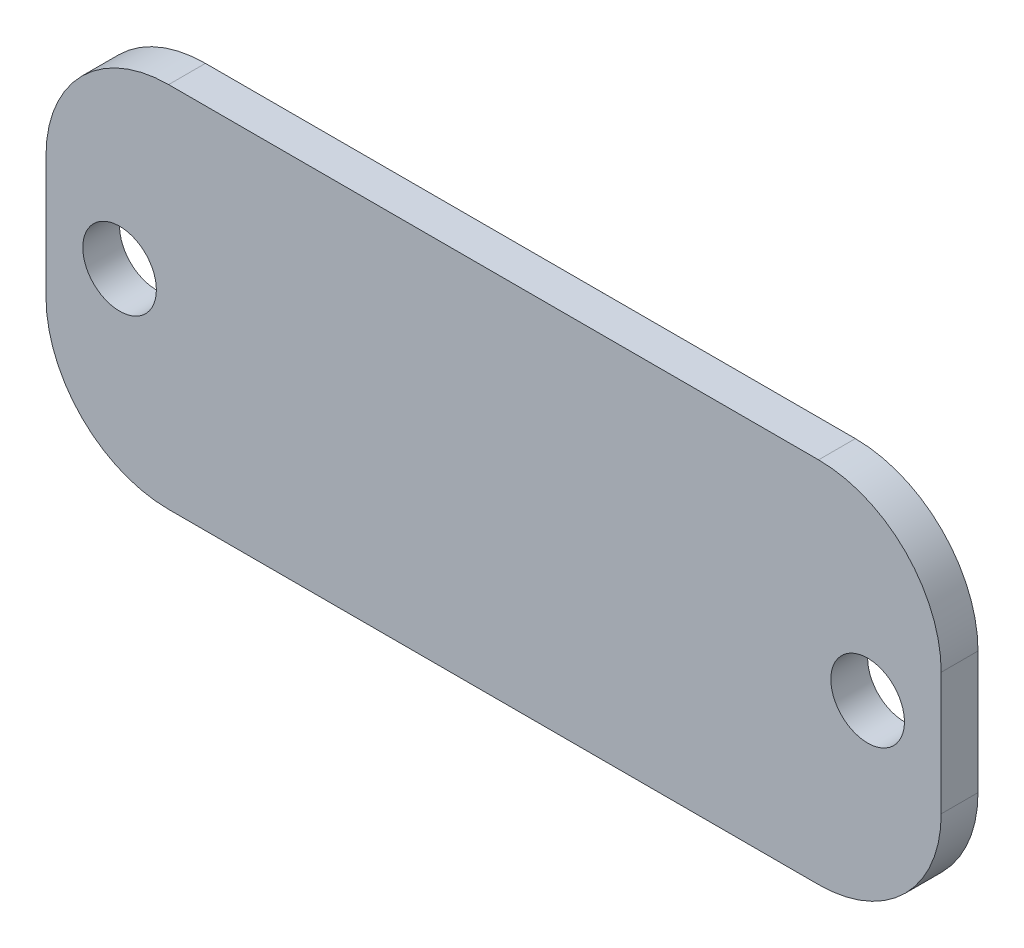
ISO-10303-21;
HEADER;
FILE_DESCRIPTION(('STEP AP214'),'2;1');
FILE_NAME('part.step','',(''),(''),'','','');
FILE_SCHEMA(('AUTOMOTIVE_DESIGN { 1 0 10303 214 1 1 1 1 }'));
ENDSEC;
DATA;
#1=APPLICATION_CONTEXT('core data for automotive mechanical design processes');
#2=APPLICATION_PROTOCOL_DEFINITION('international standard','automotive_design',2000,#1);
#3=PRODUCT_CONTEXT('',#1,'mechanical');
#4=PRODUCT('Part','Part','',(#3));
#5=PRODUCT_RELATED_PRODUCT_CATEGORY('part','',(#4));
#6=PRODUCT_DEFINITION_FORMATION('','',#4);
#7=PRODUCT_DEFINITION_CONTEXT('part definition',#1,'design');
#8=PRODUCT_DEFINITION('design','',#6,#7);
#9=PRODUCT_DEFINITION_SHAPE('','',#8);
#10=(LENGTH_UNIT() NAMED_UNIT(*) SI_UNIT(.MILLI.,.METRE.));
#11=(NAMED_UNIT(*) PLANE_ANGLE_UNIT() SI_UNIT($,.RADIAN.));
#12=(NAMED_UNIT(*) SI_UNIT($,.STERADIAN.) SOLID_ANGLE_UNIT());
#13=UNCERTAINTY_MEASURE_WITH_UNIT(LENGTH_MEASURE(1.E-05),#10,'distance_accuracy_value','');
#14=(GEOMETRIC_REPRESENTATION_CONTEXT(3) GLOBAL_UNCERTAINTY_ASSIGNED_CONTEXT((#13)) GLOBAL_UNIT_ASSIGNED_CONTEXT((#10,
#11,#12)) REPRESENTATION_CONTEXT('',''));
#15=CARTESIAN_POINT('',(0.,0.,0.));
#16=DIRECTION('',(0.,0.,1.));
#17=DIRECTION('',(1.,0.,0.));
#18=AXIS2_PLACEMENT_3D('',#15,#16,#17);
#19=CARTESIAN_POINT('',(63.,20.,3.));
#20=DIRECTION('',(0.,0.,-1.));
#21=DIRECTION('',(-1.,0.,0.));
#22=AXIS2_PLACEMENT_3D('',#19,#20,#21);
#23=PLANE('',#22);
#24=CARTESIAN_POINT('',(63.,20.,3.));
#25=DIRECTION('',(0.,0.,1.));
#26=DIRECTION('',(-1.,0.,0.));
#27=AXIS2_PLACEMENT_3D('',#24,#25,#26);
#28=CIRCLE('',#27,10.);
#29=CARTESIAN_POINT('',(73.,20.,3.));
#30=VERTEX_POINT('',#29);
#31=CARTESIAN_POINT('',(63.,30.,3.));
#32=VERTEX_POINT('',#31);
#33=EDGE_CURVE('E167',#30,#32,#28,.T.);
#34=ORIENTED_EDGE('',*,*,#33,.T.);
#35=DIRECTION('',(-1.,0.,0.));
#36=VECTOR('',#35,1.);
#37=CARTESIAN_POINT('',(10.0000000000001,30.,3.));
#38=LINE('',#37,#36);
#39=CARTESIAN_POINT('',(10.0000000000001,30.,3.));
#40=VERTEX_POINT('',#39);
#41=EDGE_CURVE('E103',#32,#40,#38,.T.);
#42=ORIENTED_EDGE('',*,*,#41,.T.);
#43=CARTESIAN_POINT('',(10.,20.,3.));
#44=DIRECTION('',(0.,0.,1.));
#45=DIRECTION('',(-1.,0.,0.));
#46=AXIS2_PLACEMENT_3D('',#43,#44,#45);
#47=CIRCLE('',#46,10.);
#48=CARTESIAN_POINT('',(0.,19.9999999999999,3.));
#49=VERTEX_POINT('',#48);
#50=EDGE_CURVE('E188',#40,#49,#47,.T.);
#51=ORIENTED_EDGE('',*,*,#50,.T.);
#52=DIRECTION('',(0.,-1.,0.));
#53=VECTOR('',#52,1.);
#54=CARTESIAN_POINT('',(0.,10.0000000000001,3.));
#55=LINE('',#54,#53);
#56=CARTESIAN_POINT('',(0.,10.0000000000001,3.));
#57=VERTEX_POINT('',#56);
#58=EDGE_CURVE('E202',#49,#57,#55,.T.);
#59=ORIENTED_EDGE('',*,*,#58,.T.);
#60=CARTESIAN_POINT('',(10.,10.,3.));
#61=DIRECTION('',(0.,0.,1.));
#62=DIRECTION('',(-1.,0.,0.));
#63=AXIS2_PLACEMENT_3D('',#60,#61,#62);
#64=CIRCLE('',#63,10.);
#65=CARTESIAN_POINT('',(10.0000000000001,0.,3.));
#66=VERTEX_POINT('',#65);
#67=EDGE_CURVE('E122',#57,#66,#64,.T.);
#68=ORIENTED_EDGE('',*,*,#67,.T.);
#69=DIRECTION('',(1.,0.,0.));
#70=VECTOR('',#69,1.);
#71=CARTESIAN_POINT('',(10.0000000000001,0.,3.));
#72=LINE('',#71,#70);
#73=CARTESIAN_POINT('',(63.,0.,3.));
#74=VERTEX_POINT('',#73);
#75=EDGE_CURVE('E116',#66,#74,#72,.T.);
#76=ORIENTED_EDGE('',*,*,#75,.T.);
#77=CARTESIAN_POINT('',(63.,10.,3.));
#78=DIRECTION('',(0.,0.,1.));
#79=DIRECTION('',(-1.,0.,0.));
#80=AXIS2_PLACEMENT_3D('',#77,#78,#79);
#81=CIRCLE('',#80,10.);
#82=CARTESIAN_POINT('',(73.,10.,3.));
#83=VERTEX_POINT('',#82);
#84=EDGE_CURVE('E120',#74,#83,#81,.T.);
#85=ORIENTED_EDGE('',*,*,#84,.T.);
#86=DIRECTION('',(0.,1.,0.));
#87=VECTOR('',#86,1.);
#88=CARTESIAN_POINT('',(73.,10.,3.));
#89=LINE('',#88,#87);
#90=EDGE_CURVE('E60',#83,#30,#89,.T.);
#91=ORIENTED_EDGE('',*,*,#90,.T.);
#92=EDGE_LOOP('',(#34,#42,#51,#59,#68,#76,#85,#91));
#93=FACE_BOUND('',#92,.T.);
#94=CARTESIAN_POINT('',(6.,15.,3.));
#95=DIRECTION('',(0.,0.,1.));
#96=DIRECTION('',(1.,0.,0.));
#97=AXIS2_PLACEMENT_3D('',#94,#95,#96);
#98=CIRCLE('',#97,3.);
#99=CARTESIAN_POINT('',(9.,15.,3.));
#100=VERTEX_POINT('',#99);
#101=EDGE_CURVE('E149',#100,#100,#98,.T.);
#102=ORIENTED_EDGE('',*,*,#101,.F.);
#103=EDGE_LOOP('',(#102));
#104=FACE_BOUND('',#103,.T.);
#105=CARTESIAN_POINT('',(67.,15.,3.));
#106=DIRECTION('',(0.,0.,1.));
#107=DIRECTION('',(-1.,0.,0.));
#108=AXIS2_PLACEMENT_3D('',#105,#106,#107);
#109=CIRCLE('',#108,3.00000000000001);
#110=CARTESIAN_POINT('',(64.,15.,3.));
#111=VERTEX_POINT('',#110);
#112=EDGE_CURVE('E216',#111,#111,#109,.T.);
#113=ORIENTED_EDGE('',*,*,#112,.F.);
#114=EDGE_LOOP('',(#113));
#115=FACE_BOUND('',#114,.T.);
#116=ADVANCED_FACE('F42',(#93,#104,#115),#23,.F.);
#117=CARTESIAN_POINT('',(63.,20.,0.));
#118=DIRECTION('',(0.,0.,-1.));
#119=DIRECTION('',(-1.,0.,0.));
#120=AXIS2_PLACEMENT_3D('',#117,#118,#119);
#121=PLANE('',#120);
#122=CARTESIAN_POINT('',(6.,15.,0.));
#123=DIRECTION('',(0.,0.,1.));
#124=DIRECTION('',(1.,0.,0.));
#125=AXIS2_PLACEMENT_3D('',#122,#123,#124);
#126=CIRCLE('',#125,3.);
#127=CARTESIAN_POINT('',(9.,15.,0.));
#128=VERTEX_POINT('',#127);
#129=EDGE_CURVE('E212',#128,#128,#126,.T.);
#130=ORIENTED_EDGE('',*,*,#129,.T.);
#131=EDGE_LOOP('',(#130));
#132=FACE_BOUND('',#131,.T.);
#133=CARTESIAN_POINT('',(63.,20.,0.));
#134=DIRECTION('',(0.,0.,1.));
#135=DIRECTION('',(-1.,0.,0.));
#136=AXIS2_PLACEMENT_3D('',#133,#134,#135);
#137=CIRCLE('',#136,10.);
#138=CARTESIAN_POINT('',(73.,20.,0.));
#139=VERTEX_POINT('',#138);
#140=CARTESIAN_POINT('',(63.,30.,0.));
#141=VERTEX_POINT('',#140);
#142=EDGE_CURVE('E144',#139,#141,#137,.T.);
#143=ORIENTED_EDGE('',*,*,#142,.F.);
#144=DIRECTION('',(0.,1.,0.));
#145=VECTOR('',#144,1.);
#146=CARTESIAN_POINT('',(73.,10.,0.));
#147=LINE('',#146,#145);
#148=CARTESIAN_POINT('',(73.,10.,0.));
#149=VERTEX_POINT('',#148);
#150=EDGE_CURVE('E95',#149,#139,#147,.T.);
#151=ORIENTED_EDGE('',*,*,#150,.F.);
#152=CARTESIAN_POINT('',(63.,10.,0.));
#153=DIRECTION('',(0.,0.,1.));
#154=DIRECTION('',(-1.,0.,0.));
#155=AXIS2_PLACEMENT_3D('',#152,#153,#154);
#156=CIRCLE('',#155,10.);
#157=CARTESIAN_POINT('',(63.,0.,0.));
#158=VERTEX_POINT('',#157);
#159=EDGE_CURVE('E89',#158,#149,#156,.T.);
#160=ORIENTED_EDGE('',*,*,#159,.F.);
#161=DIRECTION('',(1.,0.,0.));
#162=VECTOR('',#161,1.);
#163=CARTESIAN_POINT('',(10.0000000000001,0.,0.));
#164=LINE('',#163,#162);
#165=CARTESIAN_POINT('',(10.0000000000001,0.,0.));
#166=VERTEX_POINT('',#165);
#167=EDGE_CURVE('E131',#166,#158,#164,.T.);
#168=ORIENTED_EDGE('',*,*,#167,.F.);
#169=CARTESIAN_POINT('',(10.,10.,0.));
#170=DIRECTION('',(0.,0.,1.));
#171=DIRECTION('',(-1.,0.,0.));
#172=AXIS2_PLACEMENT_3D('',#169,#170,#171);
#173=CIRCLE('',#172,10.);
#174=CARTESIAN_POINT('',(0.,10.0000000000001,0.));
#175=VERTEX_POINT('',#174);
#176=EDGE_CURVE('E158',#175,#166,#173,.T.);
#177=ORIENTED_EDGE('',*,*,#176,.F.);
#178=DIRECTION('',(0.,-1.,0.));
#179=VECTOR('',#178,1.);
#180=CARTESIAN_POINT('',(0.,10.0000000000001,0.));
#181=LINE('',#180,#179);
#182=CARTESIAN_POINT('',(0.,19.9999999999999,0.));
#183=VERTEX_POINT('',#182);
#184=EDGE_CURVE('E155',#183,#175,#181,.T.);
#185=ORIENTED_EDGE('',*,*,#184,.F.);
#186=CARTESIAN_POINT('',(10.,20.,0.));
#187=DIRECTION('',(0.,0.,1.));
#188=DIRECTION('',(-1.,0.,0.));
#189=AXIS2_PLACEMENT_3D('',#186,#187,#188);
#190=CIRCLE('',#189,10.);
#191=CARTESIAN_POINT('',(10.0000000000001,30.,0.));
#192=VERTEX_POINT('',#191);
#193=EDGE_CURVE('E152',#192,#183,#190,.T.);
#194=ORIENTED_EDGE('',*,*,#193,.F.);
#195=DIRECTION('',(-1.,0.,0.));
#196=VECTOR('',#195,1.);
#197=CARTESIAN_POINT('',(10.0000000000001,30.,0.));
#198=LINE('',#197,#196);
#199=EDGE_CURVE('E148',#141,#192,#198,.T.);
#200=ORIENTED_EDGE('',*,*,#199,.F.);
#201=EDGE_LOOP('',(#143,#151,#160,#168,#177,#185,#194,#200));
#202=FACE_BOUND('',#201,.T.);
#203=CARTESIAN_POINT('',(67.,15.,0.));
#204=DIRECTION('',(0.,0.,1.));
#205=DIRECTION('',(-1.,0.,0.));
#206=AXIS2_PLACEMENT_3D('',#203,#204,#205);
#207=CIRCLE('',#206,3.00000000000001);
#208=CARTESIAN_POINT('',(64.,15.,0.));
#209=VERTEX_POINT('',#208);
#210=EDGE_CURVE('E220',#209,#209,#207,.T.);
#211=ORIENTED_EDGE('',*,*,#210,.T.);
#212=EDGE_LOOP('',(#211));
#213=FACE_BOUND('',#212,.T.);
#214=ADVANCED_FACE('F192',(#132,#202,#213),#121,.T.);
#215=CARTESIAN_POINT('',(63.,20.,3.));
#216=DIRECTION('',(0.,0.,-1.));
#217=DIRECTION('',(-1.,0.,0.));
#218=AXIS2_PLACEMENT_3D('',#215,#216,#217);
#219=CYLINDRICAL_SURFACE('',#218,10.);
#220=ORIENTED_EDGE('',*,*,#142,.T.);
#221=DIRECTION('',(0.,0.,-1.));
#222=VECTOR('',#221,1.);
#223=CARTESIAN_POINT('',(63.,30.,3.));
#224=LINE('',#223,#222);
#225=EDGE_CURVE('E11',#32,#141,#224,.T.);
#226=ORIENTED_EDGE('',*,*,#225,.F.);
#227=ORIENTED_EDGE('',*,*,#33,.F.);
#228=DIRECTION('',(0.,0.,-1.));
#229=VECTOR('',#228,1.);
#230=CARTESIAN_POINT('',(73.,20.,3.));
#231=LINE('',#230,#229);
#232=EDGE_CURVE('E140',#30,#139,#231,.T.);
#233=ORIENTED_EDGE('',*,*,#232,.T.);
#234=EDGE_LOOP('',(#220,#226,#227,#233));
#235=FACE_BOUND('',#234,.T.);
#236=ADVANCED_FACE('F44',(#235),#219,.T.);
#237=CARTESIAN_POINT('',(10.0000000000001,30.,3.));
#238=DIRECTION('',(0.,-1.,0.));
#239=DIRECTION('',(0.,0.,-1.));
#240=AXIS2_PLACEMENT_3D('',#237,#238,#239);
#241=PLANE('',#240);
#242=ORIENTED_EDGE('',*,*,#199,.T.);
#243=DIRECTION('',(0.,0.,-1.));
#244=VECTOR('',#243,1.);
#245=CARTESIAN_POINT('',(10.0000000000001,30.,3.));
#246=LINE('',#245,#244);
#247=EDGE_CURVE('E52',#40,#192,#246,.T.);
#248=ORIENTED_EDGE('',*,*,#247,.F.);
#249=ORIENTED_EDGE('',*,*,#41,.F.);
#250=ORIENTED_EDGE('',*,*,#225,.T.);
#251=EDGE_LOOP('',(#242,#248,#249,#250));
#252=FACE_BOUND('',#251,.T.);
#253=ADVANCED_FACE('F254',(#252),#241,.F.);
#254=CARTESIAN_POINT('',(10.,20.,3.));
#255=DIRECTION('',(0.,0.,-1.));
#256=DIRECTION('',(-1.,0.,0.));
#257=AXIS2_PLACEMENT_3D('',#254,#255,#256);
#258=CYLINDRICAL_SURFACE('',#257,10.);
#259=ORIENTED_EDGE('',*,*,#193,.T.);
#260=DIRECTION('',(0.,0.,-1.));
#261=VECTOR('',#260,1.);
#262=CARTESIAN_POINT('',(0.,19.9999999999999,3.));
#263=LINE('',#262,#261);
#264=EDGE_CURVE('E178',#49,#183,#263,.T.);
#265=ORIENTED_EDGE('',*,*,#264,.F.);
#266=ORIENTED_EDGE('',*,*,#50,.F.);
#267=ORIENTED_EDGE('',*,*,#247,.T.);
#268=EDGE_LOOP('',(#259,#265,#266,#267));
#269=FACE_BOUND('',#268,.T.);
#270=ADVANCED_FACE('F186',(#269),#258,.T.);
#271=CARTESIAN_POINT('',(0.,10.0000000000001,3.));
#272=DIRECTION('',(1.,0.,0.));
#273=DIRECTION('',(0.,0.,-1.));
#274=AXIS2_PLACEMENT_3D('',#271,#272,#273);
#275=PLANE('',#274);
#276=ORIENTED_EDGE('',*,*,#184,.T.);
#277=DIRECTION('',(0.,0.,-1.));
#278=VECTOR('',#277,1.);
#279=CARTESIAN_POINT('',(0.,10.0000000000001,3.));
#280=LINE('',#279,#278);
#281=EDGE_CURVE('E174',#57,#175,#280,.T.);
#282=ORIENTED_EDGE('',*,*,#281,.F.);
#283=ORIENTED_EDGE('',*,*,#58,.F.);
#284=ORIENTED_EDGE('',*,*,#264,.T.);
#285=EDGE_LOOP('',(#276,#282,#283,#284));
#286=FACE_BOUND('',#285,.T.);
#287=ADVANCED_FACE('F197',(#286),#275,.F.);
#288=CARTESIAN_POINT('',(10.,10.,3.));
#289=DIRECTION('',(0.,0.,-1.));
#290=DIRECTION('',(-1.,0.,0.));
#291=AXIS2_PLACEMENT_3D('',#288,#289,#290);
#292=CYLINDRICAL_SURFACE('',#291,10.);
#293=ORIENTED_EDGE('',*,*,#176,.T.);
#294=DIRECTION('',(0.,0.,-1.));
#295=VECTOR('',#294,1.);
#296=CARTESIAN_POINT('',(10.0000000000001,0.,3.));
#297=LINE('',#296,#295);
#298=EDGE_CURVE('E133',#66,#166,#297,.T.);
#299=ORIENTED_EDGE('',*,*,#298,.F.);
#300=ORIENTED_EDGE('',*,*,#67,.F.);
#301=ORIENTED_EDGE('',*,*,#281,.T.);
#302=EDGE_LOOP('',(#293,#299,#300,#301));
#303=FACE_BOUND('',#302,.T.);
#304=ADVANCED_FACE('F200',(#303),#292,.T.);
#305=CARTESIAN_POINT('',(10.0000000000001,0.,3.));
#306=DIRECTION('',(0.,1.,0.));
#307=DIRECTION('',(0.,0.,1.));
#308=AXIS2_PLACEMENT_3D('',#305,#306,#307);
#309=PLANE('',#308);
#310=ORIENTED_EDGE('',*,*,#167,.T.);
#311=DIRECTION('',(0.,0.,-1.));
#312=VECTOR('',#311,1.);
#313=CARTESIAN_POINT('',(63.,0.,3.));
#314=LINE('',#313,#312);
#315=EDGE_CURVE('E128',#74,#158,#314,.T.);
#316=ORIENTED_EDGE('',*,*,#315,.F.);
#317=ORIENTED_EDGE('',*,*,#75,.F.);
#318=ORIENTED_EDGE('',*,*,#298,.T.);
#319=EDGE_LOOP('',(#310,#316,#317,#318));
#320=FACE_BOUND('',#319,.T.);
#321=ADVANCED_FACE('F129',(#320),#309,.F.);
#322=CARTESIAN_POINT('',(63.,10.,3.));
#323=DIRECTION('',(0.,0.,-1.));
#324=DIRECTION('',(-1.,0.,0.));
#325=AXIS2_PLACEMENT_3D('',#322,#323,#324);
#326=CYLINDRICAL_SURFACE('',#325,10.);
#327=ORIENTED_EDGE('',*,*,#159,.T.);
#328=DIRECTION('',(0.,0.,-1.));
#329=VECTOR('',#328,1.);
#330=CARTESIAN_POINT('',(73.,10.,3.));
#331=LINE('',#330,#329);
#332=EDGE_CURVE('E134',#83,#149,#331,.T.);
#333=ORIENTED_EDGE('',*,*,#332,.F.);
#334=ORIENTED_EDGE('',*,*,#84,.F.);
#335=ORIENTED_EDGE('',*,*,#315,.T.);
#336=EDGE_LOOP('',(#327,#333,#334,#335));
#337=FACE_BOUND('',#336,.T.);
#338=ADVANCED_FACE('F136',(#337),#326,.T.);
#339=CARTESIAN_POINT('',(73.,10.,3.));
#340=DIRECTION('',(-1.,0.,0.));
#341=DIRECTION('',(0.,0.,1.));
#342=AXIS2_PLACEMENT_3D('',#339,#340,#341);
#343=PLANE('',#342);
#344=ORIENTED_EDGE('',*,*,#150,.T.);
#345=ORIENTED_EDGE('',*,*,#232,.F.);
#346=ORIENTED_EDGE('',*,*,#90,.F.);
#347=ORIENTED_EDGE('',*,*,#332,.T.);
#348=EDGE_LOOP('',(#344,#345,#346,#347));
#349=FACE_BOUND('',#348,.T.);
#350=ADVANCED_FACE('F242',(#349),#343,.F.);
#351=CARTESIAN_POINT('',(6.,15.,3.));
#352=DIRECTION('',(0.,0.,-1.));
#353=DIRECTION('',(-1.,0.,0.));
#354=AXIS2_PLACEMENT_3D('',#351,#352,#353);
#355=CYLINDRICAL_SURFACE('',#354,3.);
#356=ORIENTED_EDGE('',*,*,#101,.T.);
#357=EDGE_LOOP('',(#356));
#358=FACE_BOUND('',#357,.T.);
#359=ORIENTED_EDGE('',*,*,#129,.F.);
#360=EDGE_LOOP('',(#359));
#361=FACE_BOUND('',#360,.T.);
#362=ADVANCED_FACE('F239',(#358,#361),#355,.F.);
#363=CARTESIAN_POINT('',(67.,15.,3.));
#364=DIRECTION('',(0.,0.,-1.));
#365=DIRECTION('',(-1.,0.,0.));
#366=AXIS2_PLACEMENT_3D('',#363,#364,#365);
#367=CYLINDRICAL_SURFACE('',#366,3.00000000000001);
#368=ORIENTED_EDGE('',*,*,#112,.T.);
#369=EDGE_LOOP('',(#368));
#370=FACE_BOUND('',#369,.T.);
#371=ORIENTED_EDGE('',*,*,#210,.F.);
#372=EDGE_LOOP('',(#371));
#373=FACE_BOUND('',#372,.T.);
#374=ADVANCED_FACE('F228',(#370,#373),#367,.F.);
#375=CLOSED_SHELL('',(#116,#214,#236,#253,#270,#287,#304,#321,#338,#350,#362,#374));
#376=MANIFOLD_SOLID_BREP('B2',#375);
#377=ADVANCED_BREP_SHAPE_REPRESENTATION('',(#18,#376),#14);
#378=SHAPE_DEFINITION_REPRESENTATION(#9,#377);
ENDSEC;
END-ISO-10303-21;
